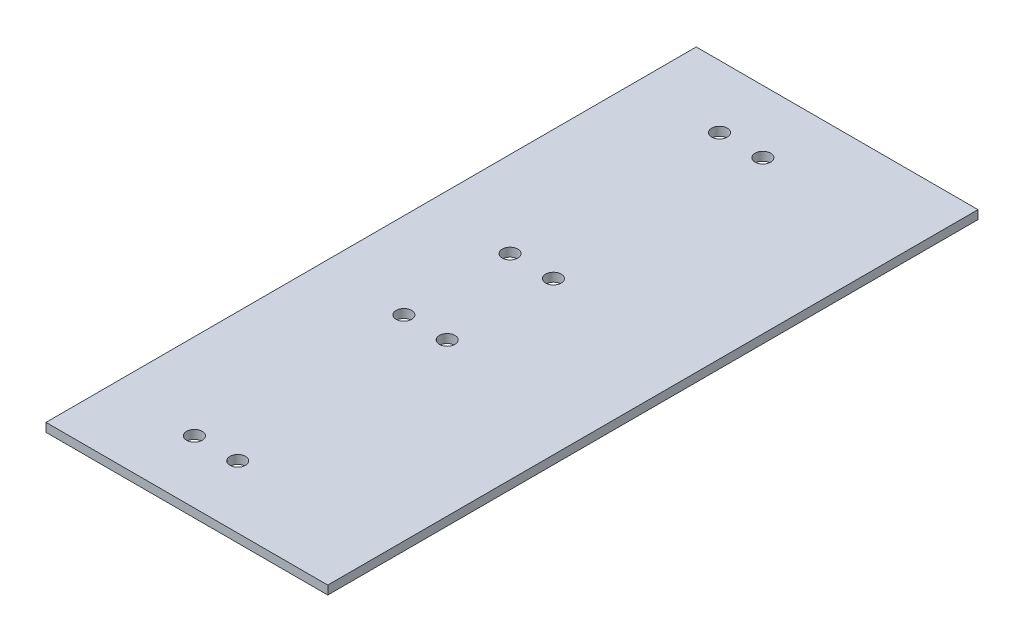
ISO-10303-21;
HEADER;
FILE_DESCRIPTION(('STEP AP214'),'2;1');
FILE_NAME('part.step','',(''),(''),'','','');
FILE_SCHEMA(('AUTOMOTIVE_DESIGN { 1 0 10303 214 1 1 1 1 }'));
ENDSEC;
DATA;
#1=APPLICATION_CONTEXT('core data for automotive mechanical design processes');
#2=APPLICATION_PROTOCOL_DEFINITION('international standard','automotive_design',2000,#1);
#3=PRODUCT_CONTEXT('',#1,'mechanical');
#4=PRODUCT('Part','Part','',(#3));
#5=PRODUCT_RELATED_PRODUCT_CATEGORY('part','',(#4));
#6=PRODUCT_DEFINITION_FORMATION('','',#4);
#7=PRODUCT_DEFINITION_CONTEXT('part definition',#1,'design');
#8=PRODUCT_DEFINITION('design','',#6,#7);
#9=PRODUCT_DEFINITION_SHAPE('','',#8);
#10=(LENGTH_UNIT() NAMED_UNIT(*) SI_UNIT(.MILLI.,.METRE.));
#11=(NAMED_UNIT(*) PLANE_ANGLE_UNIT() SI_UNIT($,.RADIAN.));
#12=(NAMED_UNIT(*) SI_UNIT($,.STERADIAN.) SOLID_ANGLE_UNIT());
#13=UNCERTAINTY_MEASURE_WITH_UNIT(LENGTH_MEASURE(1.E-05),#10,'distance_accuracy_value','');
#14=(GEOMETRIC_REPRESENTATION_CONTEXT(3) GLOBAL_UNCERTAINTY_ASSIGNED_CONTEXT((#13)) GLOBAL_UNIT_ASSIGNED_CONTEXT((#10,
#11,#12)) REPRESENTATION_CONTEXT('',''));
#15=CARTESIAN_POINT('',(0.,0.,0.));
#16=DIRECTION('',(0.,0.,1.));
#17=DIRECTION('',(1.,0.,0.));
#18=AXIS2_PLACEMENT_3D('',#15,#16,#17);
#19=CARTESIAN_POINT('',(0.,2.,0.));
#20=DIRECTION('',(0.,-1.,0.));
#21=DIRECTION('',(0.,0.,-1.));
#22=AXIS2_PLACEMENT_3D('',#19,#20,#21);
#23=PLANE('',#22);
#24=CARTESIAN_POINT('',(-12.7,2.,12.25));
#25=DIRECTION('',(0.,1.,0.));
#26=DIRECTION('',(0.,0.,-1.));
#27=AXIS2_PLACEMENT_3D('',#24,#25,#26);
#28=CIRCLE('',#27,1.8);
#29=CARTESIAN_POINT('',(-12.7,2.,10.45));
#30=VERTEX_POINT('',#29);
#31=EDGE_CURVE('E145',#30,#30,#28,.T.);
#32=ORIENTED_EDGE('',*,*,#31,.F.);
#33=EDGE_LOOP('',(#32));
#34=FACE_BOUND('',#33,.T.);
#35=CARTESIAN_POINT('',(-2.70000000000002,2.,60.57));
#36=DIRECTION('',(0.,1.,0.));
#37=DIRECTION('',(0.,0.,-1.));
#38=AXIS2_PLACEMENT_3D('',#35,#36,#37);
#39=CIRCLE('',#38,1.8);
#40=CARTESIAN_POINT('',(-2.70000000000002,2.,58.77));
#41=VERTEX_POINT('',#40);
#42=EDGE_CURVE('E133',#41,#41,#39,.T.);
#43=ORIENTED_EDGE('',*,*,#42,.F.);
#44=EDGE_LOOP('',(#43));
#45=FACE_BOUND('',#44,.T.);
#46=CARTESIAN_POINT('',(-12.7,2.,60.57));
#47=DIRECTION('',(0.,1.,0.));
#48=DIRECTION('',(0.,0.,-1.));
#49=AXIS2_PLACEMENT_3D('',#46,#47,#48);
#50=CIRCLE('',#49,1.8);
#51=CARTESIAN_POINT('',(-12.7,2.,58.77));
#52=VERTEX_POINT('',#51);
#53=EDGE_CURVE('E121',#52,#52,#50,.T.);
#54=ORIENTED_EDGE('',*,*,#53,.F.);
#55=EDGE_LOOP('',(#54));
#56=FACE_BOUND('',#55,.T.);
#57=CARTESIAN_POINT('',(-2.69999999999999,2.,-12.25));
#58=DIRECTION('',(0.,1.,0.));
#59=DIRECTION('',(0.,0.,1.));
#60=AXIS2_PLACEMENT_3D('',#57,#58,#59);
#61=CIRCLE('',#60,1.8);
#62=CARTESIAN_POINT('',(-2.69999999999999,2.,-10.45));
#63=VERTEX_POINT('',#62);
#64=EDGE_CURVE('E100',#63,#63,#61,.T.);
#65=ORIENTED_EDGE('',*,*,#64,.F.);
#66=EDGE_LOOP('',(#65));
#67=FACE_BOUND('',#66,.T.);
#68=DIRECTION('',(0.,0.,1.));
#69=VECTOR('',#68,1.);
#70=CARTESIAN_POINT('',(-32.5,2.,-75.));
#71=LINE('',#70,#69);
#72=CARTESIAN_POINT('',(-32.5,2.,-75.));
#73=VERTEX_POINT('',#72);
#74=CARTESIAN_POINT('',(-32.5,2.,75.));
#75=VERTEX_POINT('',#74);
#76=EDGE_CURVE('E85',#73,#75,#71,.T.);
#77=ORIENTED_EDGE('',*,*,#76,.T.);
#78=DIRECTION('',(1.,0.,0.));
#79=VECTOR('',#78,1.);
#80=CARTESIAN_POINT('',(32.5,2.,75.));
#81=LINE('',#80,#79);
#82=CARTESIAN_POINT('',(32.5,2.,75.));
#83=VERTEX_POINT('',#82);
#84=EDGE_CURVE('E80',#75,#83,#81,.T.);
#85=ORIENTED_EDGE('',*,*,#84,.T.);
#86=DIRECTION('',(0.,0.,-1.));
#87=VECTOR('',#86,1.);
#88=CARTESIAN_POINT('',(32.5,2.,-75.));
#89=LINE('',#88,#87);
#90=CARTESIAN_POINT('',(32.5,2.,-75.));
#91=VERTEX_POINT('',#90);
#92=EDGE_CURVE('E83',#83,#91,#89,.T.);
#93=ORIENTED_EDGE('',*,*,#92,.T.);
#94=DIRECTION('',(-1.,0.,0.));
#95=VECTOR('',#94,1.);
#96=CARTESIAN_POINT('',(32.5,2.,-75.));
#97=LINE('',#96,#95);
#98=EDGE_CURVE('E50',#91,#73,#97,.T.);
#99=ORIENTED_EDGE('',*,*,#98,.T.);
#100=EDGE_LOOP('',(#77,#85,#93,#99));
#101=FACE_BOUND('',#100,.T.);
#102=CARTESIAN_POINT('',(-2.69999999999999,2.,-60.57));
#103=DIRECTION('',(0.,1.,0.));
#104=DIRECTION('',(0.,0.,1.));
#105=AXIS2_PLACEMENT_3D('',#102,#103,#104);
#106=CIRCLE('',#105,1.8);
#107=CARTESIAN_POINT('',(-2.69999999999999,2.,-58.77));
#108=VERTEX_POINT('',#107);
#109=EDGE_CURVE('E115',#108,#108,#106,.T.);
#110=ORIENTED_EDGE('',*,*,#109,.F.);
#111=EDGE_LOOP('',(#110));
#112=FACE_BOUND('',#111,.T.);
#113=CARTESIAN_POINT('',(-12.7,2.,-12.25));
#114=DIRECTION('',(0.,1.,0.));
#115=DIRECTION('',(0.,0.,1.));
#116=AXIS2_PLACEMENT_3D('',#113,#114,#115);
#117=CIRCLE('',#116,1.8);
#118=CARTESIAN_POINT('',(-12.7,2.,-10.45));
#119=VERTEX_POINT('',#118);
#120=EDGE_CURVE('E127',#119,#119,#117,.T.);
#121=ORIENTED_EDGE('',*,*,#120,.F.);
#122=EDGE_LOOP('',(#121));
#123=FACE_BOUND('',#122,.T.);
#124=CARTESIAN_POINT('',(-12.7,2.,-60.57));
#125=DIRECTION('',(0.,1.,0.));
#126=DIRECTION('',(0.,0.,1.));
#127=AXIS2_PLACEMENT_3D('',#124,#125,#126);
#128=CIRCLE('',#127,1.8);
#129=CARTESIAN_POINT('',(-12.7,2.,-58.77));
#130=VERTEX_POINT('',#129);
#131=EDGE_CURVE('E139',#130,#130,#128,.T.);
#132=ORIENTED_EDGE('',*,*,#131,.F.);
#133=EDGE_LOOP('',(#132));
#134=FACE_BOUND('',#133,.T.);
#135=CARTESIAN_POINT('',(-2.69999999999999,2.,12.25));
#136=DIRECTION('',(0.,1.,0.));
#137=DIRECTION('',(0.,0.,-1.));
#138=AXIS2_PLACEMENT_3D('',#135,#136,#137);
#139=CIRCLE('',#138,1.8);
#140=CARTESIAN_POINT('',(-2.69999999999999,2.,10.45));
#141=VERTEX_POINT('',#140);
#142=EDGE_CURVE('E151',#141,#141,#139,.T.);
#143=ORIENTED_EDGE('',*,*,#142,.F.);
#144=EDGE_LOOP('',(#143));
#145=FACE_BOUND('',#144,.T.);
#146=ADVANCED_FACE('F33',(#34,#45,#56,#67,#101,#112,#123,#134,#145),#23,.F.);
#147=CARTESIAN_POINT('',(0.,0.,0.));
#148=DIRECTION('',(0.,-1.,0.));
#149=DIRECTION('',(0.,0.,-1.));
#150=AXIS2_PLACEMENT_3D('',#147,#148,#149);
#151=PLANE('',#150);
#152=CARTESIAN_POINT('',(-12.7,0.,12.25));
#153=DIRECTION('',(0.,1.,0.));
#154=DIRECTION('',(0.,0.,-1.));
#155=AXIS2_PLACEMENT_3D('',#152,#153,#154);
#156=CIRCLE('',#155,1.8);
#157=CARTESIAN_POINT('',(-12.7,0.,10.45));
#158=VERTEX_POINT('',#157);
#159=EDGE_CURVE('E148',#158,#158,#156,.T.);
#160=ORIENTED_EDGE('',*,*,#159,.T.);
#161=EDGE_LOOP('',(#160));
#162=FACE_BOUND('',#161,.T.);
#163=CARTESIAN_POINT('',(-2.70000000000002,0.,60.57));
#164=DIRECTION('',(0.,1.,0.));
#165=DIRECTION('',(0.,0.,-1.));
#166=AXIS2_PLACEMENT_3D('',#163,#164,#165);
#167=CIRCLE('',#166,1.8);
#168=CARTESIAN_POINT('',(-2.70000000000002,0.,58.77));
#169=VERTEX_POINT('',#168);
#170=EDGE_CURVE('E136',#169,#169,#167,.T.);
#171=ORIENTED_EDGE('',*,*,#170,.T.);
#172=EDGE_LOOP('',(#171));
#173=FACE_BOUND('',#172,.T.);
#174=CARTESIAN_POINT('',(-12.7,0.,60.57));
#175=DIRECTION('',(0.,1.,0.));
#176=DIRECTION('',(0.,0.,-1.));
#177=AXIS2_PLACEMENT_3D('',#174,#175,#176);
#178=CIRCLE('',#177,1.8);
#179=CARTESIAN_POINT('',(-12.7,0.,58.77));
#180=VERTEX_POINT('',#179);
#181=EDGE_CURVE('E124',#180,#180,#178,.T.);
#182=ORIENTED_EDGE('',*,*,#181,.T.);
#183=EDGE_LOOP('',(#182));
#184=FACE_BOUND('',#183,.T.);
#185=CARTESIAN_POINT('',(-2.69999999999999,0.,-12.25));
#186=DIRECTION('',(0.,1.,0.));
#187=DIRECTION('',(0.,0.,1.));
#188=AXIS2_PLACEMENT_3D('',#185,#186,#187);
#189=CIRCLE('',#188,1.8);
#190=CARTESIAN_POINT('',(-2.69999999999999,0.,-10.45));
#191=VERTEX_POINT('',#190);
#192=EDGE_CURVE('E112',#191,#191,#189,.T.);
#193=ORIENTED_EDGE('',*,*,#192,.T.);
#194=EDGE_LOOP('',(#193));
#195=FACE_BOUND('',#194,.T.);
#196=DIRECTION('',(0.,0.,1.));
#197=VECTOR('',#196,1.);
#198=CARTESIAN_POINT('',(-32.5,0.,-75.));
#199=LINE('',#198,#197);
#200=CARTESIAN_POINT('',(-32.5,0.,-75.));
#201=VERTEX_POINT('',#200);
#202=CARTESIAN_POINT('',(-32.5,0.,75.));
#203=VERTEX_POINT('',#202);
#204=EDGE_CURVE('E97',#201,#203,#199,.T.);
#205=ORIENTED_EDGE('',*,*,#204,.F.);
#206=DIRECTION('',(-1.,0.,0.));
#207=VECTOR('',#206,1.);
#208=CARTESIAN_POINT('',(32.5,0.,-75.));
#209=LINE('',#208,#207);
#210=CARTESIAN_POINT('',(32.5,0.,-75.));
#211=VERTEX_POINT('',#210);
#212=EDGE_CURVE('E73',#211,#201,#209,.T.);
#213=ORIENTED_EDGE('',*,*,#212,.F.);
#214=DIRECTION('',(0.,0.,-1.));
#215=VECTOR('',#214,1.);
#216=CARTESIAN_POINT('',(32.5,0.,-75.));
#217=LINE('',#216,#215);
#218=CARTESIAN_POINT('',(32.5,0.,75.));
#219=VERTEX_POINT('',#218);
#220=EDGE_CURVE('E67',#219,#211,#217,.T.);
#221=ORIENTED_EDGE('',*,*,#220,.F.);
#222=DIRECTION('',(1.,0.,0.));
#223=VECTOR('',#222,1.);
#224=CARTESIAN_POINT('',(32.5,0.,75.));
#225=LINE('',#224,#223);
#226=EDGE_CURVE('E89',#203,#219,#225,.T.);
#227=ORIENTED_EDGE('',*,*,#226,.F.);
#228=EDGE_LOOP('',(#205,#213,#221,#227));
#229=FACE_BOUND('',#228,.T.);
#230=CARTESIAN_POINT('',(-2.69999999999999,0.,-60.57));
#231=DIRECTION('',(0.,1.,0.));
#232=DIRECTION('',(0.,0.,1.));
#233=AXIS2_PLACEMENT_3D('',#230,#231,#232);
#234=CIRCLE('',#233,1.8);
#235=CARTESIAN_POINT('',(-2.69999999999999,0.,-58.77));
#236=VERTEX_POINT('',#235);
#237=EDGE_CURVE('E118',#236,#236,#234,.T.);
#238=ORIENTED_EDGE('',*,*,#237,.T.);
#239=EDGE_LOOP('',(#238));
#240=FACE_BOUND('',#239,.T.);
#241=CARTESIAN_POINT('',(-12.7,0.,-12.25));
#242=DIRECTION('',(0.,1.,0.));
#243=DIRECTION('',(0.,0.,1.));
#244=AXIS2_PLACEMENT_3D('',#241,#242,#243);
#245=CIRCLE('',#244,1.8);
#246=CARTESIAN_POINT('',(-12.7,0.,-10.45));
#247=VERTEX_POINT('',#246);
#248=EDGE_CURVE('E130',#247,#247,#245,.T.);
#249=ORIENTED_EDGE('',*,*,#248,.T.);
#250=EDGE_LOOP('',(#249));
#251=FACE_BOUND('',#250,.T.);
#252=CARTESIAN_POINT('',(-12.7,0.,-60.57));
#253=DIRECTION('',(0.,1.,0.));
#254=DIRECTION('',(0.,0.,1.));
#255=AXIS2_PLACEMENT_3D('',#252,#253,#254);
#256=CIRCLE('',#255,1.8);
#257=CARTESIAN_POINT('',(-12.7,0.,-58.77));
#258=VERTEX_POINT('',#257);
#259=EDGE_CURVE('E142',#258,#258,#256,.T.);
#260=ORIENTED_EDGE('',*,*,#259,.T.);
#261=EDGE_LOOP('',(#260));
#262=FACE_BOUND('',#261,.T.);
#263=CARTESIAN_POINT('',(-2.69999999999999,0.,12.25));
#264=DIRECTION('',(0.,1.,0.));
#265=DIRECTION('',(0.,0.,-1.));
#266=AXIS2_PLACEMENT_3D('',#263,#264,#265);
#267=CIRCLE('',#266,1.8);
#268=CARTESIAN_POINT('',(-2.69999999999999,0.,10.45));
#269=VERTEX_POINT('',#268);
#270=EDGE_CURVE('E154',#269,#269,#267,.T.);
#271=ORIENTED_EDGE('',*,*,#270,.T.);
#272=EDGE_LOOP('',(#271));
#273=FACE_BOUND('',#272,.T.);
#274=ADVANCED_FACE('F108',(#162,#173,#184,#195,#229,#240,#251,#262,#273),#151,.T.);
#275=CARTESIAN_POINT('',(-32.5,2.,-75.));
#276=DIRECTION('',(1.,0.,0.));
#277=DIRECTION('',(0.,0.,-1.));
#278=AXIS2_PLACEMENT_3D('',#275,#276,#277);
#279=PLANE('',#278);
#280=ORIENTED_EDGE('',*,*,#204,.T.);
#281=DIRECTION('',(0.,-1.,0.));
#282=VECTOR('',#281,1.);
#283=CARTESIAN_POINT('',(-32.5,2.,75.));
#284=LINE('',#283,#282);
#285=EDGE_CURVE('E11',#75,#203,#284,.T.);
#286=ORIENTED_EDGE('',*,*,#285,.F.);
#287=ORIENTED_EDGE('',*,*,#76,.F.);
#288=DIRECTION('',(0.,-1.,0.));
#289=VECTOR('',#288,1.);
#290=CARTESIAN_POINT('',(-32.5,2.,-75.));
#291=LINE('',#290,#289);
#292=EDGE_CURVE('E93',#73,#201,#291,.T.);
#293=ORIENTED_EDGE('',*,*,#292,.T.);
#294=EDGE_LOOP('',(#280,#286,#287,#293));
#295=FACE_BOUND('',#294,.T.);
#296=ADVANCED_FACE('F35',(#295),#279,.F.);
#297=CARTESIAN_POINT('',(32.5,2.,75.));
#298=DIRECTION('',(0.,0.,-1.));
#299=DIRECTION('',(-1.,0.,0.));
#300=AXIS2_PLACEMENT_3D('',#297,#298,#299);
#301=PLANE('',#300);
#302=ORIENTED_EDGE('',*,*,#226,.T.);
#303=DIRECTION('',(0.,-1.,0.));
#304=VECTOR('',#303,1.);
#305=CARTESIAN_POINT('',(32.5,2.,75.));
#306=LINE('',#305,#304);
#307=EDGE_CURVE('E42',#83,#219,#306,.T.);
#308=ORIENTED_EDGE('',*,*,#307,.F.);
#309=ORIENTED_EDGE('',*,*,#84,.F.);
#310=ORIENTED_EDGE('',*,*,#285,.T.);
#311=EDGE_LOOP('',(#302,#308,#309,#310));
#312=FACE_BOUND('',#311,.T.);
#313=ADVANCED_FACE('F88',(#312),#301,.F.);
#314=CARTESIAN_POINT('',(32.5,2.,-75.));
#315=DIRECTION('',(-1.,0.,0.));
#316=DIRECTION('',(0.,0.,1.));
#317=AXIS2_PLACEMENT_3D('',#314,#315,#316);
#318=PLANE('',#317);
#319=ORIENTED_EDGE('',*,*,#220,.T.);
#320=DIRECTION('',(0.,-1.,0.));
#321=VECTOR('',#320,1.);
#322=CARTESIAN_POINT('',(32.5,2.,-75.));
#323=LINE('',#322,#321);
#324=EDGE_CURVE('E90',#91,#211,#323,.T.);
#325=ORIENTED_EDGE('',*,*,#324,.F.);
#326=ORIENTED_EDGE('',*,*,#92,.F.);
#327=ORIENTED_EDGE('',*,*,#307,.T.);
#328=EDGE_LOOP('',(#319,#325,#326,#327));
#329=FACE_BOUND('',#328,.T.);
#330=ADVANCED_FACE('F91',(#329),#318,.F.);
#331=CARTESIAN_POINT('',(32.5,2.,-75.));
#332=DIRECTION('',(0.,0.,1.));
#333=DIRECTION('',(1.,0.,0.));
#334=AXIS2_PLACEMENT_3D('',#331,#332,#333);
#335=PLANE('',#334);
#336=ORIENTED_EDGE('',*,*,#212,.T.);
#337=ORIENTED_EDGE('',*,*,#292,.F.);
#338=ORIENTED_EDGE('',*,*,#98,.F.);
#339=ORIENTED_EDGE('',*,*,#324,.T.);
#340=EDGE_LOOP('',(#336,#337,#338,#339));
#341=FACE_BOUND('',#340,.T.);
#342=ADVANCED_FACE('F105',(#341),#335,.F.);
#343=CARTESIAN_POINT('',(-2.69999999999999,2.,-12.25));
#344=DIRECTION('',(0.,-1.,0.));
#345=DIRECTION('',(0.,0.,-1.));
#346=AXIS2_PLACEMENT_3D('',#343,#344,#345);
#347=CYLINDRICAL_SURFACE('',#346,1.8);
#348=ORIENTED_EDGE('',*,*,#64,.T.);
#349=EDGE_LOOP('',(#348));
#350=FACE_BOUND('',#349,.T.);
#351=ORIENTED_EDGE('',*,*,#192,.F.);
#352=EDGE_LOOP('',(#351));
#353=FACE_BOUND('',#352,.T.);
#354=ADVANCED_FACE('F174',(#350,#353),#347,.F.);
#355=CARTESIAN_POINT('',(-2.69999999999999,2.,-60.57));
#356=DIRECTION('',(0.,-1.,0.));
#357=DIRECTION('',(0.,0.,-1.));
#358=AXIS2_PLACEMENT_3D('',#355,#356,#357);
#359=CYLINDRICAL_SURFACE('',#358,1.8);
#360=ORIENTED_EDGE('',*,*,#109,.T.);
#361=EDGE_LOOP('',(#360));
#362=FACE_BOUND('',#361,.T.);
#363=ORIENTED_EDGE('',*,*,#237,.F.);
#364=EDGE_LOOP('',(#363));
#365=FACE_BOUND('',#364,.T.);
#366=ADVANCED_FACE('F220',(#362,#365),#359,.F.);
#367=CARTESIAN_POINT('',(-12.7,2.,60.57));
#368=DIRECTION('',(0.,-1.,0.));
#369=DIRECTION('',(0.,0.,-1.));
#370=AXIS2_PLACEMENT_3D('',#367,#368,#369);
#371=CYLINDRICAL_SURFACE('',#370,1.8);
#372=ORIENTED_EDGE('',*,*,#53,.T.);
#373=EDGE_LOOP('',(#372));
#374=FACE_BOUND('',#373,.T.);
#375=ORIENTED_EDGE('',*,*,#181,.F.);
#376=EDGE_LOOP('',(#375));
#377=FACE_BOUND('',#376,.T.);
#378=ADVANCED_FACE('F228',(#374,#377),#371,.F.);
#379=CARTESIAN_POINT('',(-12.7,2.,-12.25));
#380=DIRECTION('',(0.,-1.,0.));
#381=DIRECTION('',(0.,0.,-1.));
#382=AXIS2_PLACEMENT_3D('',#379,#380,#381);
#383=CYLINDRICAL_SURFACE('',#382,1.8);
#384=ORIENTED_EDGE('',*,*,#120,.T.);
#385=EDGE_LOOP('',(#384));
#386=FACE_BOUND('',#385,.T.);
#387=ORIENTED_EDGE('',*,*,#248,.F.);
#388=EDGE_LOOP('',(#387));
#389=FACE_BOUND('',#388,.T.);
#390=ADVANCED_FACE('F236',(#386,#389),#383,.F.);
#391=CARTESIAN_POINT('',(-2.70000000000002,2.,60.57));
#392=DIRECTION('',(0.,-1.,0.));
#393=DIRECTION('',(0.,0.,-1.));
#394=AXIS2_PLACEMENT_3D('',#391,#392,#393);
#395=CYLINDRICAL_SURFACE('',#394,1.8);
#396=ORIENTED_EDGE('',*,*,#42,.T.);
#397=EDGE_LOOP('',(#396));
#398=FACE_BOUND('',#397,.T.);
#399=ORIENTED_EDGE('',*,*,#170,.F.);
#400=EDGE_LOOP('',(#399));
#401=FACE_BOUND('',#400,.T.);
#402=ADVANCED_FACE('F245',(#398,#401),#395,.F.);
#403=CARTESIAN_POINT('',(-12.7,2.,-60.57));
#404=DIRECTION('',(0.,-1.,0.));
#405=DIRECTION('',(0.,0.,-1.));
#406=AXIS2_PLACEMENT_3D('',#403,#404,#405);
#407=CYLINDRICAL_SURFACE('',#406,1.8);
#408=ORIENTED_EDGE('',*,*,#131,.T.);
#409=EDGE_LOOP('',(#408));
#410=FACE_BOUND('',#409,.T.);
#411=ORIENTED_EDGE('',*,*,#259,.F.);
#412=EDGE_LOOP('',(#411));
#413=FACE_BOUND('',#412,.T.);
#414=ADVANCED_FACE('F254',(#410,#413),#407,.F.);
#415=CARTESIAN_POINT('',(-12.7,2.,12.25));
#416=DIRECTION('',(0.,-1.,0.));
#417=DIRECTION('',(0.,0.,-1.));
#418=AXIS2_PLACEMENT_3D('',#415,#416,#417);
#419=CYLINDRICAL_SURFACE('',#418,1.8);
#420=ORIENTED_EDGE('',*,*,#31,.T.);
#421=EDGE_LOOP('',(#420));
#422=FACE_BOUND('',#421,.T.);
#423=ORIENTED_EDGE('',*,*,#159,.F.);
#424=EDGE_LOOP('',(#423));
#425=FACE_BOUND('',#424,.T.);
#426=ADVANCED_FACE('F263',(#422,#425),#419,.F.);
#427=CARTESIAN_POINT('',(-2.69999999999999,2.,12.25));
#428=DIRECTION('',(0.,-1.,0.));
#429=DIRECTION('',(0.,0.,-1.));
#430=AXIS2_PLACEMENT_3D('',#427,#428,#429);
#431=CYLINDRICAL_SURFACE('',#430,1.8);
#432=ORIENTED_EDGE('',*,*,#142,.T.);
#433=EDGE_LOOP('',(#432));
#434=FACE_BOUND('',#433,.T.);
#435=ORIENTED_EDGE('',*,*,#270,.F.);
#436=EDGE_LOOP('',(#435));
#437=FACE_BOUND('',#436,.T.);
#438=ADVANCED_FACE('F160',(#434,#437),#431,.F.);
#439=CLOSED_SHELL('',(#146,#274,#296,#313,#330,#342,#354,#366,#378,#390,#402,#414,#426,#438));
#440=MANIFOLD_SOLID_BREP('B2',#439);
#441=ADVANCED_BREP_SHAPE_REPRESENTATION('',(#18,#440),#14);
#442=SHAPE_DEFINITION_REPRESENTATION(#9,#441);
ENDSEC;
END-ISO-10303-21;
